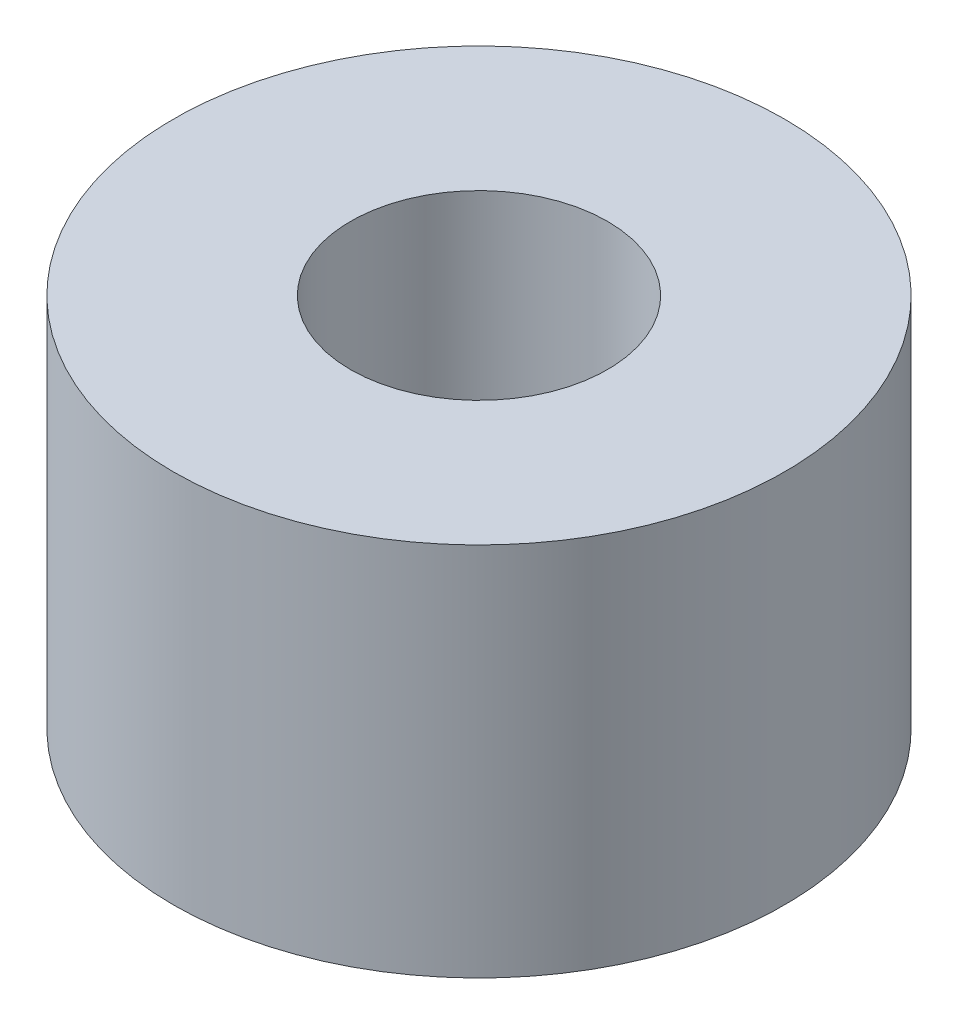
ISO-10303-21;
HEADER;
FILE_DESCRIPTION(('STEP AP214'),'2;1');
FILE_NAME('part.step','',(''),(''),'','','');
FILE_SCHEMA(('AUTOMOTIVE_DESIGN { 1 0 10303 214 1 1 1 1 }'));
ENDSEC;
DATA;
#1=APPLICATION_CONTEXT('core data for automotive mechanical design processes');
#2=APPLICATION_PROTOCOL_DEFINITION('international standard','automotive_design',2000,#1);
#3=PRODUCT_CONTEXT('',#1,'mechanical');
#4=PRODUCT('Part','Part','',(#3));
#5=PRODUCT_RELATED_PRODUCT_CATEGORY('part','',(#4));
#6=PRODUCT_DEFINITION_FORMATION('','',#4);
#7=PRODUCT_DEFINITION_CONTEXT('part definition',#1,'design');
#8=PRODUCT_DEFINITION('design','',#6,#7);
#9=PRODUCT_DEFINITION_SHAPE('','',#8);
#10=(LENGTH_UNIT() NAMED_UNIT(*) SI_UNIT(.MILLI.,.METRE.));
#11=(NAMED_UNIT(*) PLANE_ANGLE_UNIT() SI_UNIT($,.RADIAN.));
#12=(NAMED_UNIT(*) SI_UNIT($,.STERADIAN.) SOLID_ANGLE_UNIT());
#13=UNCERTAINTY_MEASURE_WITH_UNIT(LENGTH_MEASURE(1.E-05),#10,'distance_accuracy_value','');
#14=(GEOMETRIC_REPRESENTATION_CONTEXT(3) GLOBAL_UNCERTAINTY_ASSIGNED_CONTEXT((#13)) GLOBAL_UNIT_ASSIGNED_CONTEXT((#10,
#11,#12)) REPRESENTATION_CONTEXT('',''));
#15=CARTESIAN_POINT('',(0.,0.,0.));
#16=DIRECTION('',(0.,0.,1.));
#17=DIRECTION('',(1.,0.,0.));
#18=AXIS2_PLACEMENT_3D('',#15,#16,#17);
#19=CARTESIAN_POINT('',(0.,68.58,0.));
#20=DIRECTION('',(0.,1.,0.));
#21=DIRECTION('',(0.,0.,1.));
#22=AXIS2_PLACEMENT_3D('',#19,#20,#21);
#23=PLANE('',#22);
#24=CARTESIAN_POINT('',(0.,68.58,0.));
#25=DIRECTION('',(0.,1.,0.));
#26=DIRECTION('',(0.,0.,1.));
#27=AXIS2_PLACEMENT_3D('',#24,#25,#26);
#28=CIRCLE('',#27,55.88);
#29=CARTESIAN_POINT('',(0.,68.58,55.88));
#30=VERTEX_POINT('',#29);
#31=EDGE_CURVE('E10',#30,#30,#28,.T.);
#32=ORIENTED_EDGE('',*,*,#31,.T.);
#33=EDGE_LOOP('',(#32));
#34=FACE_BOUND('',#33,.T.);
#35=CARTESIAN_POINT('',(0.,68.58,0.));
#36=DIRECTION('',(0.,1.,0.));
#37=DIRECTION('',(0.,0.,1.));
#38=AXIS2_PLACEMENT_3D('',#35,#36,#37);
#39=CIRCLE('',#38,23.495);
#40=CARTESIAN_POINT('',(0.,68.58,23.495));
#41=VERTEX_POINT('',#40);
#42=EDGE_CURVE('E44',#41,#41,#39,.T.);
#43=ORIENTED_EDGE('',*,*,#42,.F.);
#44=EDGE_LOOP('',(#43));
#45=FACE_BOUND('',#44,.T.);
#46=ADVANCED_FACE('F33',(#34,#45),#23,.T.);
#47=CARTESIAN_POINT('',(0.,0.,0.));
#48=DIRECTION('',(0.,1.,0.));
#49=DIRECTION('',(0.,0.,1.));
#50=AXIS2_PLACEMENT_3D('',#47,#48,#49);
#51=PLANE('',#50);
#52=CARTESIAN_POINT('',(0.,0.,0.));
#53=DIRECTION('',(0.,1.,0.));
#54=DIRECTION('',(0.,0.,1.));
#55=AXIS2_PLACEMENT_3D('',#52,#53,#54);
#56=CIRCLE('',#55,55.88);
#57=CARTESIAN_POINT('',(0.,0.,55.88));
#58=VERTEX_POINT('',#57);
#59=EDGE_CURVE('E37',#58,#58,#56,.T.);
#60=ORIENTED_EDGE('',*,*,#59,.F.);
#61=EDGE_LOOP('',(#60));
#62=FACE_BOUND('',#61,.T.);
#63=CARTESIAN_POINT('',(0.,0.,0.));
#64=DIRECTION('',(0.,1.,0.));
#65=DIRECTION('',(0.,0.,1.));
#66=AXIS2_PLACEMENT_3D('',#63,#64,#65);
#67=CIRCLE('',#66,23.495);
#68=CARTESIAN_POINT('',(0.,0.,23.495));
#69=VERTEX_POINT('',#68);
#70=EDGE_CURVE('E46',#69,#69,#67,.T.);
#71=ORIENTED_EDGE('',*,*,#70,.T.);
#72=EDGE_LOOP('',(#71));
#73=FACE_BOUND('',#72,.T.);
#74=ADVANCED_FACE('F56',(#62,#73),#51,.F.);
#75=CARTESIAN_POINT('',(0.,68.58,0.));
#76=DIRECTION('',(0.,-1.,0.));
#77=DIRECTION('',(0.,0.,-1.));
#78=AXIS2_PLACEMENT_3D('',#75,#76,#77);
#79=CYLINDRICAL_SURFACE('',#78,55.88);
#80=ORIENTED_EDGE('',*,*,#31,.F.);
#81=EDGE_LOOP('',(#80));
#82=FACE_BOUND('',#81,.T.);
#83=ORIENTED_EDGE('',*,*,#59,.T.);
#84=EDGE_LOOP('',(#83));
#85=FACE_BOUND('',#84,.T.);
#86=ADVANCED_FACE('F35',(#82,#85),#79,.T.);
#87=CARTESIAN_POINT('',(0.,68.58,0.));
#88=DIRECTION('',(0.,-1.,0.));
#89=DIRECTION('',(0.,0.,-1.));
#90=AXIS2_PLACEMENT_3D('',#87,#88,#89);
#91=CYLINDRICAL_SURFACE('',#90,23.495);
#92=ORIENTED_EDGE('',*,*,#42,.T.);
#93=EDGE_LOOP('',(#92));
#94=FACE_BOUND('',#93,.T.);
#95=ORIENTED_EDGE('',*,*,#70,.F.);
#96=EDGE_LOOP('',(#95));
#97=FACE_BOUND('',#96,.T.);
#98=ADVANCED_FACE('F52',(#94,#97),#91,.F.);
#99=CLOSED_SHELL('',(#46,#74,#86,#98));
#100=MANIFOLD_SOLID_BREP('B2',#99);
#101=ADVANCED_BREP_SHAPE_REPRESENTATION('',(#18,#100),#14);
#102=SHAPE_DEFINITION_REPRESENTATION(#9,#101);
ENDSEC;
END-ISO-10303-21;
